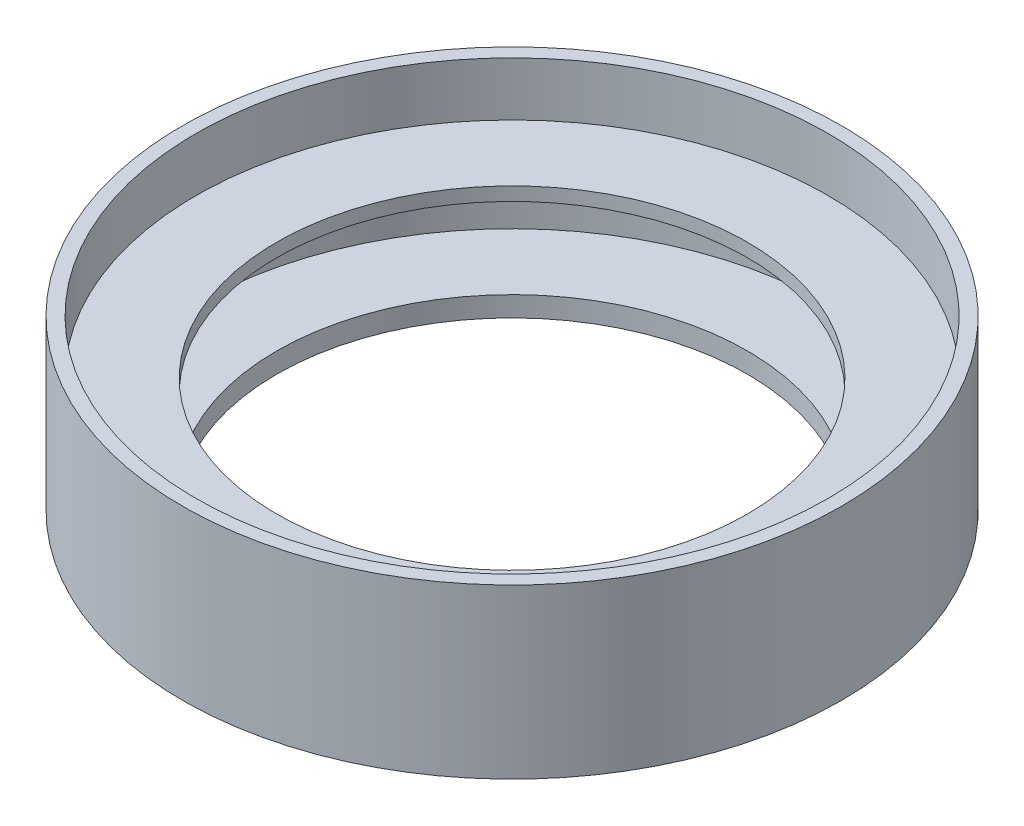
ISO-10303-21;
HEADER;
FILE_DESCRIPTION(('STEP AP214'),'2;1');
FILE_NAME('part.step','',(''),(''),'','','');
FILE_SCHEMA(('AUTOMOTIVE_DESIGN { 1 0 10303 214 1 1 1 1 }'));
ENDSEC;
DATA;
#1=APPLICATION_CONTEXT('core data for automotive mechanical design processes');
#2=APPLICATION_PROTOCOL_DEFINITION('international standard','automotive_design',2000,#1);
#3=PRODUCT_CONTEXT('',#1,'mechanical');
#4=PRODUCT('Part','Part','',(#3));
#5=PRODUCT_RELATED_PRODUCT_CATEGORY('part','',(#4));
#6=PRODUCT_DEFINITION_FORMATION('','',#4);
#7=PRODUCT_DEFINITION_CONTEXT('part definition',#1,'design');
#8=PRODUCT_DEFINITION('design','',#6,#7);
#9=PRODUCT_DEFINITION_SHAPE('','',#8);
#10=(LENGTH_UNIT() NAMED_UNIT(*) SI_UNIT(.MILLI.,.METRE.));
#11=(NAMED_UNIT(*) PLANE_ANGLE_UNIT() SI_UNIT($,.RADIAN.));
#12=(NAMED_UNIT(*) SI_UNIT($,.STERADIAN.) SOLID_ANGLE_UNIT());
#13=UNCERTAINTY_MEASURE_WITH_UNIT(LENGTH_MEASURE(1.E-05),#10,'distance_accuracy_value','');
#14=(GEOMETRIC_REPRESENTATION_CONTEXT(3) GLOBAL_UNCERTAINTY_ASSIGNED_CONTEXT((#13)) GLOBAL_UNIT_ASSIGNED_CONTEXT((#10,
#11,#12)) REPRESENTATION_CONTEXT('',''));
#15=CARTESIAN_POINT('',(0.,0.,0.));
#16=DIRECTION('',(0.,0.,1.));
#17=DIRECTION('',(1.,0.,0.));
#18=AXIS2_PLACEMENT_3D('',#15,#16,#17);
#19=CARTESIAN_POINT('',(0.,0.,0.));
#20=DIRECTION('',(0.,1.,0.));
#21=DIRECTION('',(1.,0.,0.));
#22=AXIS2_PLACEMENT_3D('',#19,#20,#21);
#23=PLANE('',#22);
#24=CARTESIAN_POINT('',(0.,0.,0.));
#25=DIRECTION('',(0.,-1.,0.));
#26=DIRECTION('',(1.,0.,0.));
#27=AXIS2_PLACEMENT_3D('',#24,#25,#26);
#28=CIRCLE('',#27,17.5);
#29=CARTESIAN_POINT('',(-17.5,0.,0.));
#30=VERTEX_POINT('',#29);
#31=EDGE_CURVE('E111',#30,#30,#28,.T.);
#32=ORIENTED_EDGE('',*,*,#31,.F.);
#33=EDGE_LOOP('',(#32));
#34=FACE_BOUND('',#33,.T.);
#35=CARTESIAN_POINT('',(0.,0.,0.));
#36=DIRECTION('',(0.,1.,0.));
#37=DIRECTION('',(-1.,0.,0.));
#38=AXIS2_PLACEMENT_3D('',#35,#36,#37);
#39=CIRCLE('',#38,24.5);
#40=CARTESIAN_POINT('',(24.5,0.,0.));
#41=VERTEX_POINT('',#40);
#42=EDGE_CURVE('E11',#41,#41,#39,.T.);
#43=ORIENTED_EDGE('',*,*,#42,.F.);
#44=EDGE_LOOP('',(#43));
#45=FACE_BOUND('',#44,.T.);
#46=ADVANCED_FACE('F17',(#34,#45),#23,.F.);
#47=CARTESIAN_POINT('',(0.,1.5,0.));
#48=DIRECTION('',(0.,1.,0.));
#49=DIRECTION('',(1.,0.,0.));
#50=AXIS2_PLACEMENT_3D('',#47,#48,#49);
#51=PLANE('',#50);
#52=CARTESIAN_POINT('',(0.,1.5,0.));
#53=DIRECTION('',(0.,-1.,0.));
#54=DIRECTION('',(1.,0.,0.));
#55=AXIS2_PLACEMENT_3D('',#52,#53,#54);
#56=CIRCLE('',#55,17.5);
#57=CARTESIAN_POINT('',(-17.5,1.5,0.));
#58=VERTEX_POINT('',#57);
#59=EDGE_CURVE('E90',#58,#58,#56,.T.);
#60=ORIENTED_EDGE('',*,*,#59,.T.);
#61=EDGE_LOOP('',(#60));
#62=FACE_BOUND('',#61,.T.);
#63=CARTESIAN_POINT('',(0.,1.5,0.));
#64=DIRECTION('',(0.,1.,0.));
#65=DIRECTION('',(-1.,0.,0.));
#66=AXIS2_PLACEMENT_3D('',#63,#64,#65);
#67=CIRCLE('',#66,23.5);
#68=CARTESIAN_POINT('',(23.5,1.5,0.));
#69=VERTEX_POINT('',#68);
#70=EDGE_CURVE('E89',#69,#69,#67,.T.);
#71=ORIENTED_EDGE('',*,*,#70,.T.);
#72=EDGE_LOOP('',(#71));
#73=FACE_BOUND('',#72,.T.);
#74=ADVANCED_FACE('F147',(#62,#73),#51,.T.);
#75=CARTESIAN_POINT('',(0.,0.,0.));
#76=DIRECTION('',(0.,1.,0.));
#77=DIRECTION('',(-1.,0.,0.));
#78=AXIS2_PLACEMENT_3D('',#75,#76,#77);
#79=CYLINDRICAL_SURFACE('',#78,24.5);
#80=CARTESIAN_POINT('',(0.,12.5,0.));
#81=DIRECTION('',(0.,1.,0.));
#82=DIRECTION('',(1.,0.,0.));
#83=AXIS2_PLACEMENT_3D('',#80,#81,#82);
#84=CIRCLE('',#83,24.5);
#85=CARTESIAN_POINT('',(24.5,12.5,0.));
#86=VERTEX_POINT('',#85);
#87=EDGE_CURVE('E98',#86,#86,#84,.T.);
#88=ORIENTED_EDGE('',*,*,#87,.F.);
#89=DIRECTION('',(0.,-1.,0.));
#90=VECTOR('',#89,1.);
#91=CARTESIAN_POINT('',(24.5,0.,0.));
#92=LINE('',#91,#90);
#93=EDGE_CURVE('E27',#86,#41,#92,.T.);
#94=ORIENTED_EDGE('',*,*,#93,.T.);
#95=ORIENTED_EDGE('',*,*,#42,.T.);
#96=ORIENTED_EDGE('',*,*,#93,.F.);
#97=EDGE_LOOP('',(#88,#94,#95,#96));
#98=FACE_BOUND('',#97,.T.);
#99=ADVANCED_FACE('F150',(#98),#79,.T.);
#100=CARTESIAN_POINT('',(0.,0.,0.));
#101=DIRECTION('',(0.,1.,0.));
#102=DIRECTION('',(1.,0.,0.));
#103=AXIS2_PLACEMENT_3D('',#100,#101,#102);
#104=CYLINDRICAL_SURFACE('',#103,17.5);
#105=ORIENTED_EDGE('',*,*,#59,.F.);
#106=DIRECTION('',(0.,-1.,0.));
#107=VECTOR('',#106,1.);
#108=CARTESIAN_POINT('',(-17.5,0.,0.));
#109=LINE('',#108,#107);
#110=EDGE_CURVE('E94',#58,#30,#109,.T.);
#111=ORIENTED_EDGE('',*,*,#110,.T.);
#112=ORIENTED_EDGE('',*,*,#31,.T.);
#113=ORIENTED_EDGE('',*,*,#110,.F.);
#114=EDGE_LOOP('',(#105,#111,#112,#113));
#115=FACE_BOUND('',#114,.T.);
#116=ADVANCED_FACE('F19',(#115),#104,.F.);
#117=CARTESIAN_POINT('',(0.,1.5,0.));
#118=DIRECTION('',(0.,1.,0.));
#119=DIRECTION('',(-1.,0.,0.));
#120=AXIS2_PLACEMENT_3D('',#117,#118,#119);
#121=CYLINDRICAL_SURFACE('',#120,23.5);
#122=CARTESIAN_POINT('',(0.,7.5,0.));
#123=DIRECTION('',(0.,-1.,0.));
#124=DIRECTION('',(-1.,0.,0.));
#125=AXIS2_PLACEMENT_3D('',#122,#123,#124);
#126=CIRCLE('',#125,23.5);
#127=CARTESIAN_POINT('',(23.5,7.5,0.));
#128=VERTEX_POINT('',#127);
#129=EDGE_CURVE('E102',#128,#128,#126,.T.);
#130=ORIENTED_EDGE('',*,*,#129,.F.);
#131=DIRECTION('',(0.,-1.,0.));
#132=VECTOR('',#131,1.);
#133=CARTESIAN_POINT('',(23.5,1.5,0.));
#134=LINE('',#133,#132);
#135=EDGE_CURVE('E85',#128,#69,#134,.T.);
#136=ORIENTED_EDGE('',*,*,#135,.T.);
#137=ORIENTED_EDGE('',*,*,#70,.F.);
#138=ORIENTED_EDGE('',*,*,#135,.F.);
#139=EDGE_LOOP('',(#130,#136,#137,#138));
#140=FACE_BOUND('',#139,.T.);
#141=ADVANCED_FACE('F154',(#140),#121,.F.);
#142=CARTESIAN_POINT('',(0.,8.5,0.));
#143=DIRECTION('',(0.,1.,0.));
#144=DIRECTION('',(1.,0.,0.));
#145=AXIS2_PLACEMENT_3D('',#142,#143,#144);
#146=PLANE('',#145);
#147=CARTESIAN_POINT('',(0.,8.5,0.));
#148=DIRECTION('',(0.,-1.,0.));
#149=DIRECTION('',(-1.,0.,0.));
#150=AXIS2_PLACEMENT_3D('',#147,#148,#149);
#151=CIRCLE('',#150,17.5);
#152=CARTESIAN_POINT('',(17.5,8.5,0.));
#153=VERTEX_POINT('',#152);
#154=EDGE_CURVE('E107',#153,#153,#151,.T.);
#155=ORIENTED_EDGE('',*,*,#154,.T.);
#156=EDGE_LOOP('',(#155));
#157=FACE_BOUND('',#156,.T.);
#158=CARTESIAN_POINT('',(0.,8.5,0.));
#159=DIRECTION('',(0.,1.,0.));
#160=DIRECTION('',(-1.,0.,0.));
#161=AXIS2_PLACEMENT_3D('',#158,#159,#160);
#162=CIRCLE('',#161,23.5);
#163=CARTESIAN_POINT('',(23.5,8.5,0.));
#164=VERTEX_POINT('',#163);
#165=EDGE_CURVE('E61',#164,#164,#162,.T.);
#166=ORIENTED_EDGE('',*,*,#165,.T.);
#167=EDGE_LOOP('',(#166));
#168=FACE_BOUND('',#167,.T.);
#169=ADVANCED_FACE('F167',(#157,#168),#146,.T.);
#170=CARTESIAN_POINT('',(0.,7.5,0.));
#171=DIRECTION('',(0.,1.,0.));
#172=DIRECTION('',(-1.,0.,0.));
#173=AXIS2_PLACEMENT_3D('',#170,#171,#172);
#174=CYLINDRICAL_SURFACE('',#173,17.5);
#175=ORIENTED_EDGE('',*,*,#154,.F.);
#176=DIRECTION('',(0.,-1.,0.));
#177=VECTOR('',#176,1.);
#178=CARTESIAN_POINT('',(17.5,7.5,0.));
#179=LINE('',#178,#177);
#180=CARTESIAN_POINT('',(17.5,7.5,0.));
#181=VERTEX_POINT('',#180);
#182=EDGE_CURVE('E84',#153,#181,#179,.T.);
#183=ORIENTED_EDGE('',*,*,#182,.T.);
#184=CARTESIAN_POINT('',(0.,7.5,0.));
#185=DIRECTION('',(0.,-1.,0.));
#186=DIRECTION('',(-1.,0.,0.));
#187=AXIS2_PLACEMENT_3D('',#184,#185,#186);
#188=CIRCLE('',#187,17.5);
#189=EDGE_CURVE('E103',#181,#181,#188,.T.);
#190=ORIENTED_EDGE('',*,*,#189,.T.);
#191=ORIENTED_EDGE('',*,*,#182,.F.);
#192=EDGE_LOOP('',(#175,#183,#190,#191));
#193=FACE_BOUND('',#192,.T.);
#194=ADVANCED_FACE('F131',(#193),#174,.F.);
#195=CARTESIAN_POINT('',(0.,7.5,0.));
#196=DIRECTION('',(0.,1.,0.));
#197=DIRECTION('',(1.,0.,0.));
#198=AXIS2_PLACEMENT_3D('',#195,#196,#197);
#199=PLANE('',#198);
#200=ORIENTED_EDGE('',*,*,#189,.F.);
#201=EDGE_LOOP('',(#200));
#202=FACE_BOUND('',#201,.T.);
#203=ORIENTED_EDGE('',*,*,#129,.T.);
#204=EDGE_LOOP('',(#203));
#205=FACE_BOUND('',#204,.T.);
#206=ADVANCED_FACE('F156',(#202,#205),#199,.F.);
#207=CARTESIAN_POINT('',(0.,12.5,0.));
#208=DIRECTION('',(0.,1.,0.));
#209=DIRECTION('',(1.,0.,0.));
#210=AXIS2_PLACEMENT_3D('',#207,#208,#209);
#211=PLANE('',#210);
#212=CARTESIAN_POINT('',(0.,12.5,0.));
#213=DIRECTION('',(0.,-1.,0.));
#214=DIRECTION('',(-1.,0.,0.));
#215=AXIS2_PLACEMENT_3D('',#212,#213,#214);
#216=CIRCLE('',#215,23.5);
#217=CARTESIAN_POINT('',(23.5,12.5,0.));
#218=VERTEX_POINT('',#217);
#219=EDGE_CURVE('E71',#218,#218,#216,.T.);
#220=ORIENTED_EDGE('',*,*,#219,.T.);
#221=EDGE_LOOP('',(#220));
#222=FACE_BOUND('',#221,.T.);
#223=ORIENTED_EDGE('',*,*,#87,.T.);
#224=EDGE_LOOP('',(#223));
#225=FACE_BOUND('',#224,.T.);
#226=ADVANCED_FACE('F75',(#222,#225),#211,.T.);
#227=CARTESIAN_POINT('',(0.,8.5,0.));
#228=DIRECTION('',(0.,1.,0.));
#229=DIRECTION('',(-1.,0.,0.));
#230=AXIS2_PLACEMENT_3D('',#227,#228,#229);
#231=CYLINDRICAL_SURFACE('',#230,23.5);
#232=ORIENTED_EDGE('',*,*,#219,.F.);
#233=DIRECTION('',(0.,-1.,0.));
#234=VECTOR('',#233,1.);
#235=CARTESIAN_POINT('',(23.5,8.5,0.));
#236=LINE('',#235,#234);
#237=EDGE_CURVE('E68',#218,#164,#236,.T.);
#238=ORIENTED_EDGE('',*,*,#237,.T.);
#239=ORIENTED_EDGE('',*,*,#165,.F.);
#240=ORIENTED_EDGE('',*,*,#237,.F.);
#241=EDGE_LOOP('',(#232,#238,#239,#240));
#242=FACE_BOUND('',#241,.T.);
#243=ADVANCED_FACE('F70',(#242),#231,.F.);
#244=CLOSED_SHELL('',(#46,#74,#99,#116,#141,#169,#194,#206,#226,#243));
#245=MANIFOLD_SOLID_BREP('B1',#244);
#246=ADVANCED_BREP_SHAPE_REPRESENTATION('',(#18,#245),#14);
#247=SHAPE_DEFINITION_REPRESENTATION(#9,#246);
ENDSEC;
END-ISO-10303-21;
